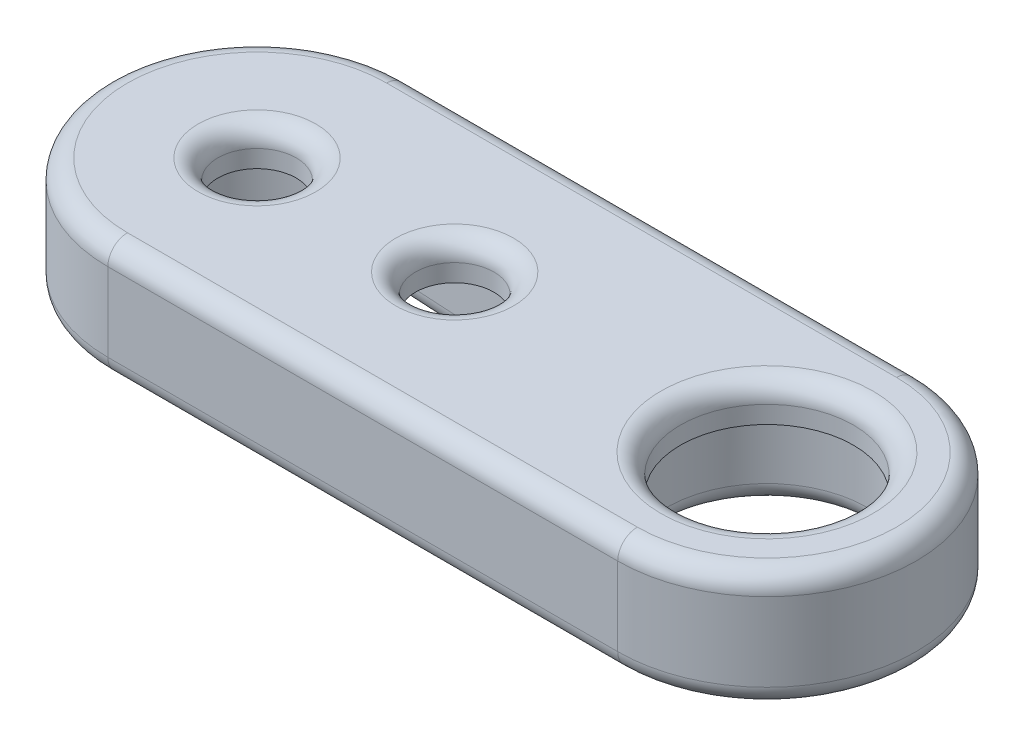
ISO-10303-21;
HEADER;
FILE_DESCRIPTION(('STEP AP214'),'2;1');
FILE_NAME('part.step','',(''),(''),'','','');
FILE_SCHEMA(('AUTOMOTIVE_DESIGN { 1 0 10303 214 1 1 1 1 }'));
ENDSEC;
DATA;
#1=APPLICATION_CONTEXT('core data for automotive mechanical design processes');
#2=APPLICATION_PROTOCOL_DEFINITION('international standard','automotive_design',2000,#1);
#3=PRODUCT_CONTEXT('',#1,'mechanical');
#4=PRODUCT('Part','Part','',(#3));
#5=PRODUCT_RELATED_PRODUCT_CATEGORY('part','',(#4));
#6=PRODUCT_DEFINITION_FORMATION('','',#4);
#7=PRODUCT_DEFINITION_CONTEXT('part definition',#1,'design');
#8=PRODUCT_DEFINITION('design','',#6,#7);
#9=PRODUCT_DEFINITION_SHAPE('','',#8);
#10=(LENGTH_UNIT() NAMED_UNIT(*) SI_UNIT(.MILLI.,.METRE.));
#11=(NAMED_UNIT(*) PLANE_ANGLE_UNIT() SI_UNIT($,.RADIAN.));
#12=(NAMED_UNIT(*) SI_UNIT($,.STERADIAN.) SOLID_ANGLE_UNIT());
#13=UNCERTAINTY_MEASURE_WITH_UNIT(LENGTH_MEASURE(1.E-05),#10,'distance_accuracy_value','');
#14=(GEOMETRIC_REPRESENTATION_CONTEXT(3) GLOBAL_UNCERTAINTY_ASSIGNED_CONTEXT((#13)) GLOBAL_UNIT_ASSIGNED_CONTEXT((#10,
#11,#12)) REPRESENTATION_CONTEXT('',''));
#15=CARTESIAN_POINT('',(0.,0.,0.));
#16=DIRECTION('',(0.,0.,1.));
#17=DIRECTION('',(1.,0.,0.));
#18=AXIS2_PLACEMENT_3D('',#15,#16,#17);
#19=CARTESIAN_POINT('',(0.,4.5,0.));
#20=DIRECTION('',(0.,-1.,0.));
#21=DIRECTION('',(0.,0.,-1.));
#22=AXIS2_PLACEMENT_3D('',#19,#20,#21);
#23=CYLINDRICAL_SURFACE('',#22,6.04);
#24=DIRECTION('',(0.,-1.,0.));
#25=VECTOR('',#24,1.);
#26=CARTESIAN_POINT('',(0.,4.5,6.04));
#27=LINE('',#26,#25);
#28=CARTESIAN_POINT('',(0.,5.20625,6.04));
#29=VERTEX_POINT('',#28);
#30=CARTESIAN_POINT('',(0.,2.03125,6.04));
#31=VERTEX_POINT('',#30);
#32=EDGE_CURVE('E218',#29,#31,#27,.T.);
#33=ORIENTED_EDGE('',*,*,#32,.F.);
#34=CARTESIAN_POINT('',(0.,5.20625,0.));
#35=DIRECTION('',(0.,-1.,0.));
#36=DIRECTION('',(0.,0.,-1.));
#37=AXIS2_PLACEMENT_3D('',#34,#35,#36);
#38=CIRCLE('',#37,6.04);
#39=CARTESIAN_POINT('',(0.,5.20625,-6.04));
#40=VERTEX_POINT('',#39);
#41=EDGE_CURVE('E61',#29,#40,#38,.T.);
#42=ORIENTED_EDGE('',*,*,#41,.T.);
#43=DIRECTION('',(0.,-1.,0.));
#44=VECTOR('',#43,1.);
#45=CARTESIAN_POINT('',(0.,4.5,-6.04));
#46=LINE('',#45,#44);
#47=CARTESIAN_POINT('',(0.,2.03125,-6.04));
#48=VERTEX_POINT('',#47);
#49=EDGE_CURVE('E201',#40,#48,#46,.T.);
#50=ORIENTED_EDGE('',*,*,#49,.T.);
#51=CARTESIAN_POINT('',(0.,2.03125,0.));
#52=DIRECTION('',(0.,-1.,0.));
#53=DIRECTION('',(0.,0.,-1.));
#54=AXIS2_PLACEMENT_3D('',#51,#52,#53);
#55=CIRCLE('',#54,6.04);
#56=EDGE_CURVE('E255',#48,#31,#55,.F.);
#57=ORIENTED_EDGE('',*,*,#56,.T.);
#58=EDGE_LOOP('',(#33,#42,#50,#57));
#59=FACE_BOUND('',#58,.T.);
#60=ADVANCED_FACE('F40',(#59),#23,.T.);
#61=CARTESIAN_POINT('',(0.,4.5,6.04));
#62=DIRECTION('',(0.,0.,-1.));
#63=DIRECTION('',(-1.,0.,0.));
#64=AXIS2_PLACEMENT_3D('',#61,#62,#63);
#65=PLANE('',#64);
#66=DIRECTION('',(0.,-1.,0.));
#67=VECTOR('',#66,1.);
#68=CARTESIAN_POINT('',(20.6375,4.5,6.04));
#69=LINE('',#68,#67);
#70=CARTESIAN_POINT('',(20.6375,5.20625,6.04));
#71=VERTEX_POINT('',#70);
#72=CARTESIAN_POINT('',(20.6375,2.03125,6.04));
#73=VERTEX_POINT('',#72);
#74=EDGE_CURVE('E215',#71,#73,#69,.T.);
#75=ORIENTED_EDGE('',*,*,#74,.F.);
#76=DIRECTION('',(-1.,0.,0.));
#77=VECTOR('',#76,1.);
#78=CARTESIAN_POINT('',(0.,5.20625,6.04));
#79=LINE('',#78,#77);
#80=EDGE_CURVE('E72',#71,#29,#79,.T.);
#81=ORIENTED_EDGE('',*,*,#80,.T.);
#82=ORIENTED_EDGE('',*,*,#32,.T.);
#83=DIRECTION('',(1.,0.,0.));
#84=VECTOR('',#83,1.);
#85=CARTESIAN_POINT('',(20.6375,2.03125,6.04));
#86=LINE('',#85,#84);
#87=EDGE_CURVE('E259',#31,#73,#86,.T.);
#88=ORIENTED_EDGE('',*,*,#87,.T.);
#89=EDGE_LOOP('',(#75,#81,#82,#88));
#90=FACE_BOUND('',#89,.T.);
#91=ADVANCED_FACE('F380',(#90),#65,.F.);
#92=CARTESIAN_POINT('',(20.6375,4.5,0.));
#93=DIRECTION('',(0.,-1.,0.));
#94=DIRECTION('',(0.,0.,-1.));
#95=AXIS2_PLACEMENT_3D('',#92,#93,#94);
#96=CYLINDRICAL_SURFACE('',#95,6.04);
#97=DIRECTION('',(0.,-1.,0.));
#98=VECTOR('',#97,1.);
#99=CARTESIAN_POINT('',(20.6375,4.5,-6.04));
#100=LINE('',#99,#98);
#101=CARTESIAN_POINT('',(20.6375,5.20625,-6.04));
#102=VERTEX_POINT('',#101);
#103=CARTESIAN_POINT('',(20.6375,2.03125,-6.04));
#104=VERTEX_POINT('',#103);
#105=EDGE_CURVE('E207',#102,#104,#100,.T.);
#106=ORIENTED_EDGE('',*,*,#105,.F.);
#107=CARTESIAN_POINT('',(20.6375,5.20625,0.));
#108=DIRECTION('',(0.,-1.,0.));
#109=DIRECTION('',(0.,0.,-1.));
#110=AXIS2_PLACEMENT_3D('',#107,#108,#109);
#111=CIRCLE('',#110,6.04);
#112=EDGE_CURVE('E282',#102,#71,#111,.T.);
#113=ORIENTED_EDGE('',*,*,#112,.T.);
#114=ORIENTED_EDGE('',*,*,#74,.T.);
#115=CARTESIAN_POINT('',(20.6375,2.03125,0.));
#116=DIRECTION('',(0.,-1.,0.));
#117=DIRECTION('',(0.,0.,-1.));
#118=AXIS2_PLACEMENT_3D('',#115,#116,#117);
#119=CIRCLE('',#118,6.04);
#120=EDGE_CURVE('E263',#73,#104,#119,.F.);
#121=ORIENTED_EDGE('',*,*,#120,.T.);
#122=EDGE_LOOP('',(#106,#113,#114,#121));
#123=FACE_BOUND('',#122,.T.);
#124=ADVANCED_FACE('F385',(#123),#96,.T.);
#125=CARTESIAN_POINT('',(0.,4.5,-6.04));
#126=DIRECTION('',(0.,0.,1.));
#127=DIRECTION('',(1.,0.,0.));
#128=AXIS2_PLACEMENT_3D('',#125,#126,#127);
#129=PLANE('',#128);
#130=ORIENTED_EDGE('',*,*,#49,.F.);
#131=DIRECTION('',(1.,0.,0.));
#132=VECTOR('',#131,1.);
#133=CARTESIAN_POINT('',(0.,5.20625,-6.04));
#134=LINE('',#133,#132);
#135=EDGE_CURVE('E431',#40,#102,#134,.T.);
#136=ORIENTED_EDGE('',*,*,#135,.T.);
#137=ORIENTED_EDGE('',*,*,#105,.T.);
#138=DIRECTION('',(-1.,0.,0.));
#139=VECTOR('',#138,1.);
#140=CARTESIAN_POINT('',(0.,2.03125,-6.04));
#141=LINE('',#140,#139);
#142=EDGE_CURVE('E221',#104,#48,#141,.T.);
#143=ORIENTED_EDGE('',*,*,#142,.T.);
#144=EDGE_LOOP('',(#130,#136,#137,#143));
#145=FACE_BOUND('',#144,.T.);
#146=ADVANCED_FACE('F428',(#145),#129,.F.);
#147=CARTESIAN_POINT('',(0.,4.5,0.));
#148=DIRECTION('',(0.,-1.,0.));
#149=DIRECTION('',(0.,0.,-1.));
#150=AXIS2_PLACEMENT_3D('',#147,#148,#149);
#151=CYLINDRICAL_SURFACE('',#150,3.5);
#152=DIRECTION('',(0.,-1.,0.));
#153=VECTOR('',#152,1.);
#154=CARTESIAN_POINT('',(2.28637267303474,4.5,2.65));
#155=LINE('',#154,#153);
#156=CARTESIAN_POINT('',(2.28637267303474,4.5,2.65));
#157=VERTEX_POINT('',#156);
#158=CARTESIAN_POINT('',(2.28637267303474,2.03125,2.65));
#159=VERTEX_POINT('',#158);
#160=EDGE_CURVE('E190',#157,#159,#155,.T.);
#161=ORIENTED_EDGE('',*,*,#160,.T.);
#162=CARTESIAN_POINT('',(0.,2.03125,0.));
#163=DIRECTION('',(0.,-1.,0.));
#164=DIRECTION('',(0.,0.,-1.));
#165=AXIS2_PLACEMENT_3D('',#162,#163,#164);
#166=CIRCLE('',#165,3.5);
#167=CARTESIAN_POINT('',(2.28637267303474,2.03125,-2.65));
#168=VERTEX_POINT('',#167);
#169=EDGE_CURVE('E271',#159,#168,#166,.T.);
#170=ORIENTED_EDGE('',*,*,#169,.T.);
#171=DIRECTION('',(0.,-1.,0.));
#172=VECTOR('',#171,1.);
#173=CARTESIAN_POINT('',(2.28637267303474,4.5,-2.65));
#174=LINE('',#173,#172);
#175=CARTESIAN_POINT('',(2.28637267303474,4.5,-2.65));
#176=VERTEX_POINT('',#175);
#177=EDGE_CURVE('E193',#176,#168,#174,.T.);
#178=ORIENTED_EDGE('',*,*,#177,.F.);
#179=CARTESIAN_POINT('',(0.,4.5,0.));
#180=DIRECTION('',(0.,1.,0.));
#181=DIRECTION('',(0.,0.,1.));
#182=AXIS2_PLACEMENT_3D('',#179,#180,#181);
#183=CIRCLE('',#182,3.5);
#184=EDGE_CURVE('E175',#176,#157,#183,.T.);
#185=ORIENTED_EDGE('',*,*,#184,.T.);
#186=EDGE_LOOP('',(#161,#170,#178,#185));
#187=FACE_BOUND('',#186,.T.);
#188=ADVANCED_FACE('F188',(#187),#151,.F.);
#189=CARTESIAN_POINT('',(2.28637267303474,4.5,2.65));
#190=DIRECTION('',(-0.0551466582265049,0.,-0.998478265204831));
#191=DIRECTION('',(-0.998478265204831,0.,0.0551466582265049));
#192=AXIS2_PLACEMENT_3D('',#189,#190,#191);
#193=PLANE('',#192);
#194=DIRECTION('',(0.,-1.,0.));
#195=VECTOR('',#194,1.);
#196=CARTESIAN_POINT('',(14.110293316453,4.5,1.99695653040966));
#197=LINE('',#196,#195);
#198=CARTESIAN_POINT('',(14.110293316453,4.5,1.99695653040966));
#199=VERTEX_POINT('',#198);
#200=CARTESIAN_POINT('',(14.110293316453,2.03125,1.99695653040966));
#201=VERTEX_POINT('',#200);
#202=EDGE_CURVE('E202',#199,#201,#197,.T.);
#203=ORIENTED_EDGE('',*,*,#202,.T.);
#204=DIRECTION('',(-0.998478265204831,0.,0.0551466582265049));
#205=VECTOR('',#204,1.);
#206=CARTESIAN_POINT('',(2.28637267303474,2.03125,2.65));
#207=LINE('',#206,#205);
#208=EDGE_CURVE('E199',#201,#159,#207,.T.);
#209=ORIENTED_EDGE('',*,*,#208,.T.);
#210=ORIENTED_EDGE('',*,*,#160,.F.);
#211=DIRECTION('',(0.998478265204831,0.,-0.0551466582265049));
#212=VECTOR('',#211,1.);
#213=CARTESIAN_POINT('',(2.28637267303474,4.5,2.65));
#214=LINE('',#213,#212);
#215=EDGE_CURVE('E172',#157,#199,#214,.T.);
#216=ORIENTED_EDGE('',*,*,#215,.T.);
#217=EDGE_LOOP('',(#203,#209,#210,#216));
#218=FACE_BOUND('',#217,.T.);
#219=ADVANCED_FACE('F197',(#218),#193,.T.);
#220=CARTESIAN_POINT('',(14.,4.5,0.));
#221=DIRECTION('',(0.,-1.,0.));
#222=DIRECTION('',(0.,0.,-1.));
#223=AXIS2_PLACEMENT_3D('',#220,#221,#222);
#224=CYLINDRICAL_SURFACE('',#223,2.);
#225=DIRECTION('',(0.,-1.,0.));
#226=VECTOR('',#225,1.);
#227=CARTESIAN_POINT('',(14.110293316453,4.5,-1.99695653040966));
#228=LINE('',#227,#226);
#229=CARTESIAN_POINT('',(14.110293316453,4.5,-1.99695653040966));
#230=VERTEX_POINT('',#229);
#231=CARTESIAN_POINT('',(14.110293316453,2.03125,-1.99695653040966));
#232=VERTEX_POINT('',#231);
#233=EDGE_CURVE('E210',#230,#232,#228,.T.);
#234=ORIENTED_EDGE('',*,*,#233,.T.);
#235=CARTESIAN_POINT('',(14.,2.03125,0.));
#236=DIRECTION('',(0.,-1.,0.));
#237=DIRECTION('',(0.,0.,-1.));
#238=AXIS2_PLACEMENT_3D('',#235,#236,#237);
#239=CIRCLE('',#238,2.);
#240=EDGE_CURVE('E277',#232,#201,#239,.T.);
#241=ORIENTED_EDGE('',*,*,#240,.T.);
#242=ORIENTED_EDGE('',*,*,#202,.F.);
#243=CARTESIAN_POINT('',(14.,4.5,0.));
#244=DIRECTION('',(0.,1.,0.));
#245=DIRECTION('',(0.,0.,-1.));
#246=AXIS2_PLACEMENT_3D('',#243,#244,#245);
#247=CIRCLE('',#246,2.);
#248=EDGE_CURVE('E178',#199,#230,#247,.T.);
#249=ORIENTED_EDGE('',*,*,#248,.T.);
#250=EDGE_LOOP('',(#234,#241,#242,#249));
#251=FACE_BOUND('',#250,.T.);
#252=ADVANCED_FACE('F514',(#251),#224,.F.);
#253=CARTESIAN_POINT('',(2.28637267303474,4.5,-2.65));
#254=DIRECTION('',(-0.0551466582265049,0.,0.998478265204831));
#255=DIRECTION('',(0.998478265204831,0.,0.0551466582265049));
#256=AXIS2_PLACEMENT_3D('',#253,#254,#255);
#257=PLANE('',#256);
#258=ORIENTED_EDGE('',*,*,#177,.T.);
#259=DIRECTION('',(0.998478265204831,0.,0.0551466582265049));
#260=VECTOR('',#259,1.);
#261=CARTESIAN_POINT('',(2.28637267303474,2.03125,-2.65));
#262=LINE('',#261,#260);
#263=EDGE_CURVE('E274',#168,#232,#262,.T.);
#264=ORIENTED_EDGE('',*,*,#263,.T.);
#265=ORIENTED_EDGE('',*,*,#233,.F.);
#266=DIRECTION('',(-0.998478265204831,0.,-0.0551466582265049));
#267=VECTOR('',#266,1.);
#268=CARTESIAN_POINT('',(2.28637267303474,4.5,-2.65));
#269=LINE('',#268,#267);
#270=EDGE_CURVE('E488',#230,#176,#269,.T.);
#271=ORIENTED_EDGE('',*,*,#270,.T.);
#272=EDGE_LOOP('',(#258,#264,#265,#271));
#273=FACE_BOUND('',#272,.T.);
#274=ADVANCED_FACE('F528',(#273),#257,.T.);
#275=CARTESIAN_POINT('',(20.6375,4.5,0.));
#276=DIRECTION('',(0.,-1.,0.));
#277=DIRECTION('',(0.,0.,-1.));
#278=AXIS2_PLACEMENT_3D('',#275,#276,#277);
#279=CYLINDRICAL_SURFACE('',#278,4.064);
#280=CARTESIAN_POINT('',(20.6375,2.03125,0.));
#281=DIRECTION('',(0.,-1.,0.));
#282=DIRECTION('',(0.,0.,-1.));
#283=AXIS2_PLACEMENT_3D('',#280,#281,#282);
#284=CIRCLE('',#283,4.064);
#285=CARTESIAN_POINT('',(20.6375,2.03125,-4.064));
#286=VERTEX_POINT('',#285);
#287=EDGE_CURVE('E267',#286,#286,#284,.T.);
#288=ORIENTED_EDGE('',*,*,#287,.T.);
#289=EDGE_LOOP('',(#288));
#290=FACE_BOUND('',#289,.T.);
#291=CARTESIAN_POINT('',(20.6375,4.5,0.));
#292=DIRECTION('',(0.,1.,0.));
#293=DIRECTION('',(0.,0.,1.));
#294=AXIS2_PLACEMENT_3D('',#291,#292,#293);
#295=CIRCLE('',#294,4.064);
#296=CARTESIAN_POINT('',(20.6375,4.5,4.064));
#297=VERTEX_POINT('',#296);
#298=EDGE_CURVE('E195',#297,#297,#295,.T.);
#299=ORIENTED_EDGE('',*,*,#298,.T.);
#300=EDGE_LOOP('',(#299));
#301=FACE_BOUND('',#300,.T.);
#302=ADVANCED_FACE('F530',(#290,#301),#279,.F.);
#303=CARTESIAN_POINT('',(20.6375,4.5,0.));
#304=DIRECTION('',(0.,1.,0.));
#305=DIRECTION('',(0.,0.,1.));
#306=AXIS2_PLACEMENT_3D('',#303,#304,#305);
#307=PLANE('',#306);
#308=CARTESIAN_POINT('',(8.,4.5,0.));
#309=DIRECTION('',(0.,1.,0.));
#310=DIRECTION('',(0.,0.,1.));
#311=AXIS2_PLACEMENT_3D('',#308,#309,#310);
#312=CIRCLE('',#311,1.5875);
#313=CARTESIAN_POINT('',(8.,4.5,1.5875));
#314=VERTEX_POINT('',#313);
#315=EDGE_CURVE('E483',#314,#314,#312,.T.);
#316=ORIENTED_EDGE('',*,*,#315,.T.);
#317=EDGE_LOOP('',(#316));
#318=FACE_BOUND('',#317,.T.);
#319=CARTESIAN_POINT('',(0.,4.5,0.));
#320=DIRECTION('',(0.,1.,0.));
#321=DIRECTION('',(0.,0.,1.));
#322=AXIS2_PLACEMENT_3D('',#319,#320,#321);
#323=CIRCLE('',#322,1.5875);
#324=CARTESIAN_POINT('',(0.,4.5,1.5875));
#325=VERTEX_POINT('',#324);
#326=EDGE_CURVE('E298',#325,#325,#323,.T.);
#327=ORIENTED_EDGE('',*,*,#326,.T.);
#328=EDGE_LOOP('',(#327));
#329=FACE_BOUND('',#328,.T.);
#330=ORIENTED_EDGE('',*,*,#184,.F.);
#331=ORIENTED_EDGE('',*,*,#270,.F.);
#332=ORIENTED_EDGE('',*,*,#248,.F.);
#333=ORIENTED_EDGE('',*,*,#215,.F.);
#334=EDGE_LOOP('',(#330,#331,#332,#333));
#335=FACE_BOUND('',#334,.T.);
#336=ADVANCED_FACE('F174',(#318,#329,#335),#307,.F.);
#337=CARTESIAN_POINT('',(20.6375,4.5,0.));
#338=DIRECTION('',(0.,1.,0.));
#339=DIRECTION('',(0.,0.,1.));
#340=AXIS2_PLACEMENT_3D('',#337,#338,#339);
#341=CIRCLE('',#340,3.5);
#342=CARTESIAN_POINT('',(20.6375,4.5,3.5));
#343=VERTEX_POINT('',#342);
#344=EDGE_CURVE('E485',#343,#343,#341,.T.);
#345=ORIENTED_EDGE('',*,*,#344,.T.);
#346=EDGE_LOOP('',(#345));
#347=FACE_BOUND('',#346,.T.);
#348=ORIENTED_EDGE('',*,*,#298,.F.);
#349=EDGE_LOOP('',(#348));
#350=FACE_BOUND('',#349,.T.);
#351=ADVANCED_FACE('F681',(#347,#350),#307,.F.);
#352=CARTESIAN_POINT('',(0.,46.8763703135805,0.));
#353=DIRECTION('',(0.,-1.,0.));
#354=DIRECTION('',(0.,0.,-1.));
#355=AXIS2_PLACEMENT_3D('',#352,#353,#354);
#356=CYLINDRICAL_SURFACE('',#355,1.5875);
#357=CARTESIAN_POINT('',(0.,5.20625,0.));
#358=DIRECTION('',(0.,-1.,0.));
#359=DIRECTION('',(0.,0.,-1.));
#360=AXIS2_PLACEMENT_3D('',#357,#358,#359);
#361=CIRCLE('',#360,1.5875);
#362=CARTESIAN_POINT('',(0.,5.20625,-1.5875));
#363=VERTEX_POINT('',#362);
#364=EDGE_CURVE('E434',#363,#363,#361,.F.);
#365=ORIENTED_EDGE('',*,*,#364,.T.);
#366=EDGE_LOOP('',(#365));
#367=FACE_BOUND('',#366,.T.);
#368=ORIENTED_EDGE('',*,*,#326,.F.);
#369=EDGE_LOOP('',(#368));
#370=FACE_BOUND('',#369,.T.);
#371=ADVANCED_FACE('F675',(#367,#370),#356,.F.);
#372=CARTESIAN_POINT('',(20.6375,46.8763703135805,0.));
#373=DIRECTION('',(0.,-1.,0.));
#374=DIRECTION('',(0.,0.,-1.));
#375=AXIS2_PLACEMENT_3D('',#372,#373,#374);
#376=CYLINDRICAL_SURFACE('',#375,3.5);
#377=CARTESIAN_POINT('',(20.6375,5.20625,0.));
#378=DIRECTION('',(0.,-1.,0.));
#379=DIRECTION('',(0.,0.,-1.));
#380=AXIS2_PLACEMENT_3D('',#377,#378,#379);
#381=CIRCLE('',#380,3.5);
#382=CARTESIAN_POINT('',(20.6375,5.20625,-3.5));
#383=VERTEX_POINT('',#382);
#384=EDGE_CURVE('E50',#383,#383,#381,.F.);
#385=ORIENTED_EDGE('',*,*,#384,.T.);
#386=EDGE_LOOP('',(#385));
#387=FACE_BOUND('',#386,.T.);
#388=ORIENTED_EDGE('',*,*,#344,.F.);
#389=EDGE_LOOP('',(#388));
#390=FACE_BOUND('',#389,.T.);
#391=ADVANCED_FACE('F680',(#387,#390),#376,.F.);
#392=CARTESIAN_POINT('',(8.,46.8763703135805,0.));
#393=DIRECTION('',(0.,-1.,0.));
#394=DIRECTION('',(0.,0.,-1.));
#395=AXIS2_PLACEMENT_3D('',#392,#393,#394);
#396=CYLINDRICAL_SURFACE('',#395,1.5875);
#397=CARTESIAN_POINT('',(8.,5.20625,0.));
#398=DIRECTION('',(0.,-1.,0.));
#399=DIRECTION('',(0.,0.,-1.));
#400=AXIS2_PLACEMENT_3D('',#397,#398,#399);
#401=CIRCLE('',#400,1.5875);
#402=CARTESIAN_POINT('',(8.,5.20625,-1.5875));
#403=VERTEX_POINT('',#402);
#404=EDGE_CURVE('E12',#403,#403,#401,.F.);
#405=ORIENTED_EDGE('',*,*,#404,.T.);
#406=EDGE_LOOP('',(#405));
#407=FACE_BOUND('',#406,.T.);
#408=ORIENTED_EDGE('',*,*,#315,.F.);
#409=EDGE_LOOP('',(#408));
#410=FACE_BOUND('',#409,.T.);
#411=ADVANCED_FACE('F693',(#407,#410),#396,.F.);
#412=CARTESIAN_POINT('',(0.,6.,0.));
#413=DIRECTION('',(0.,-1.,0.));
#414=DIRECTION('',(0.,0.,-1.));
#415=AXIS2_PLACEMENT_3D('',#412,#413,#414);
#416=PLANE('',#415);
#417=DIRECTION('',(-1.,0.,0.));
#418=VECTOR('',#417,1.);
#419=CARTESIAN_POINT('',(0.,6.,5.24625));
#420=LINE('',#419,#418);
#421=CARTESIAN_POINT('',(0.,6.,5.24625));
#422=VERTEX_POINT('',#421);
#423=CARTESIAN_POINT('',(20.6375,6.,5.24625));
#424=VERTEX_POINT('',#423);
#425=EDGE_CURVE('E465',#422,#424,#420,.F.);
#426=ORIENTED_EDGE('',*,*,#425,.T.);
#427=CARTESIAN_POINT('',(20.6375,6.,0.));
#428=DIRECTION('',(0.,-1.,0.));
#429=DIRECTION('',(0.,0.,-1.));
#430=AXIS2_PLACEMENT_3D('',#427,#428,#429);
#431=CIRCLE('',#430,5.24625);
#432=CARTESIAN_POINT('',(20.6375,6.,-5.24625));
#433=VERTEX_POINT('',#432);
#434=EDGE_CURVE('E468',#424,#433,#431,.F.);
#435=ORIENTED_EDGE('',*,*,#434,.T.);
#436=DIRECTION('',(1.,0.,0.));
#437=VECTOR('',#436,1.);
#438=CARTESIAN_POINT('',(0.,6.,-5.24625));
#439=LINE('',#438,#437);
#440=CARTESIAN_POINT('',(0.,6.,-5.24625));
#441=VERTEX_POINT('',#440);
#442=EDGE_CURVE('E460',#433,#441,#439,.F.);
#443=ORIENTED_EDGE('',*,*,#442,.T.);
#444=CARTESIAN_POINT('',(0.,6.,0.));
#445=DIRECTION('',(0.,-1.,0.));
#446=DIRECTION('',(0.,0.,-1.));
#447=AXIS2_PLACEMENT_3D('',#444,#445,#446);
#448=CIRCLE('',#447,5.24625);
#449=EDGE_CURVE('E463',#441,#422,#448,.F.);
#450=ORIENTED_EDGE('',*,*,#449,.T.);
#451=EDGE_LOOP('',(#426,#435,#443,#450));
#452=FACE_BOUND('',#451,.T.);
#453=CARTESIAN_POINT('',(0.,6.,0.));
#454=DIRECTION('',(0.,-1.,0.));
#455=DIRECTION('',(0.,0.,-1.));
#456=AXIS2_PLACEMENT_3D('',#453,#454,#455);
#457=CIRCLE('',#456,2.38125);
#458=CARTESIAN_POINT('',(0.,6.,-2.38125));
#459=VERTEX_POINT('',#458);
#460=EDGE_CURVE('E470',#459,#459,#457,.T.);
#461=ORIENTED_EDGE('',*,*,#460,.T.);
#462=EDGE_LOOP('',(#461));
#463=FACE_BOUND('',#462,.T.);
#464=CARTESIAN_POINT('',(20.6375,6.,0.));
#465=DIRECTION('',(0.,-1.,0.));
#466=DIRECTION('',(0.,0.,-1.));
#467=AXIS2_PLACEMENT_3D('',#464,#465,#466);
#468=CIRCLE('',#467,4.29375);
#469=CARTESIAN_POINT('',(20.6375,6.,-4.29375));
#470=VERTEX_POINT('',#469);
#471=EDGE_CURVE('E481',#470,#470,#468,.T.);
#472=ORIENTED_EDGE('',*,*,#471,.T.);
#473=EDGE_LOOP('',(#472));
#474=FACE_BOUND('',#473,.T.);
#475=CARTESIAN_POINT('',(8.,6.,0.));
#476=DIRECTION('',(0.,-1.,0.));
#477=DIRECTION('',(0.,0.,-1.));
#478=AXIS2_PLACEMENT_3D('',#475,#476,#477);
#479=CIRCLE('',#478,2.38125);
#480=CARTESIAN_POINT('',(8.,6.,-2.38125));
#481=VERTEX_POINT('',#480);
#482=EDGE_CURVE('E479',#481,#481,#479,.T.);
#483=ORIENTED_EDGE('',*,*,#482,.T.);
#484=EDGE_LOOP('',(#483));
#485=FACE_BOUND('',#484,.T.);
#486=ADVANCED_FACE('F406',(#452,#463,#474,#485),#416,.F.);
#487=CARTESIAN_POINT('',(0.,1.2375,0.));
#488=DIRECTION('',(0.,-1.,0.));
#489=DIRECTION('',(0.,0.,-1.));
#490=AXIS2_PLACEMENT_3D('',#487,#488,#489);
#491=PLANE('',#490);
#492=CARTESIAN_POINT('',(0.,1.2375,0.));
#493=DIRECTION('',(0.,-1.,0.));
#494=DIRECTION('',(0.,0.,-1.));
#495=AXIS2_PLACEMENT_3D('',#492,#493,#494);
#496=CIRCLE('',#495,5.24625);
#497=CARTESIAN_POINT('',(0.,1.2375,5.24625));
#498=VERTEX_POINT('',#497);
#499=CARTESIAN_POINT('',(0.,1.2375,-5.24625));
#500=VERTEX_POINT('',#499);
#501=EDGE_CURVE('E248',#498,#500,#496,.T.);
#502=ORIENTED_EDGE('',*,*,#501,.T.);
#503=DIRECTION('',(-1.,0.,0.));
#504=VECTOR('',#503,1.);
#505=CARTESIAN_POINT('',(20.6375,1.2375,-5.24625));
#506=LINE('',#505,#504);
#507=CARTESIAN_POINT('',(20.6375,1.2375,-5.24625));
#508=VERTEX_POINT('',#507);
#509=EDGE_CURVE('E251',#500,#508,#506,.F.);
#510=ORIENTED_EDGE('',*,*,#509,.T.);
#511=CARTESIAN_POINT('',(20.6375,1.2375,0.));
#512=DIRECTION('',(0.,-1.,0.));
#513=DIRECTION('',(0.,0.,-1.));
#514=AXIS2_PLACEMENT_3D('',#511,#512,#513);
#515=CIRCLE('',#514,5.24625);
#516=CARTESIAN_POINT('',(20.6375,1.2375,5.24625));
#517=VERTEX_POINT('',#516);
#518=EDGE_CURVE('E242',#508,#517,#515,.T.);
#519=ORIENTED_EDGE('',*,*,#518,.T.);
#520=DIRECTION('',(1.,0.,0.));
#521=VECTOR('',#520,1.);
#522=CARTESIAN_POINT('',(0.,1.2375,5.24625));
#523=LINE('',#522,#521);
#524=EDGE_CURVE('E245',#517,#498,#523,.F.);
#525=ORIENTED_EDGE('',*,*,#524,.T.);
#526=EDGE_LOOP('',(#502,#510,#519,#525));
#527=FACE_BOUND('',#526,.T.);
#528=CARTESIAN_POINT('',(14.,1.2375,0.));
#529=DIRECTION('',(0.,-1.,0.));
#530=DIRECTION('',(0.,0.,-1.));
#531=AXIS2_PLACEMENT_3D('',#528,#529,#530);
#532=CIRCLE('',#531,2.79375);
#533=CARTESIAN_POINT('',(16.1290930508475,1.2375,-1.80886755826209));
#534=VERTEX_POINT('',#533);
#535=CARTESIAN_POINT('',(14.1540659764203,1.2375,-2.789498653416));
#536=VERTEX_POINT('',#535);
#537=EDGE_CURVE('E237',#534,#536,#532,.F.);
#538=ORIENTED_EDGE('',*,*,#537,.T.);
#539=DIRECTION('',(0.998478265204831,0.,0.0551466582265049));
#540=VECTOR('',#539,1.);
#541=CARTESIAN_POINT('',(0.196642131210011,1.2375,-3.56037700834582));
#542=LINE('',#541,#540);
#543=CARTESIAN_POINT('',(2.58493378599355,1.2375,-3.42846997719523));
#544=VERTEX_POINT('',#543);
#545=EDGE_CURVE('E239',#536,#544,#542,.F.);
#546=ORIENTED_EDGE('',*,*,#545,.T.);
#547=CARTESIAN_POINT('',(0.,1.2375,0.));
#548=DIRECTION('',(0.,-1.,0.));
#549=DIRECTION('',(0.,0.,-1.));
#550=AXIS2_PLACEMENT_3D('',#547,#548,#549);
#551=CIRCLE('',#550,4.29375);
#552=CARTESIAN_POINT('',(2.58493378599355,1.2375,3.42846997719523));
#553=VERTEX_POINT('',#552);
#554=EDGE_CURVE('E231',#544,#553,#551,.F.);
#555=ORIENTED_EDGE('',*,*,#554,.T.);
#556=DIRECTION('',(-0.998478265204831,0.,0.0551466582265049));
#557=VECTOR('',#556,1.);
#558=CARTESIAN_POINT('',(0.196642131210011,1.2375,3.56037700834582));
#559=LINE('',#558,#557);
#560=CARTESIAN_POINT('',(14.1540659764203,1.2375,2.789498653416));
#561=VERTEX_POINT('',#560);
#562=EDGE_CURVE('E225',#553,#561,#559,.F.);
#563=ORIENTED_EDGE('',*,*,#562,.T.);
#564=CARTESIAN_POINT('',(14.,1.2375,0.));
#565=DIRECTION('',(0.,-1.,0.));
#566=DIRECTION('',(0.,0.,-1.));
#567=AXIS2_PLACEMENT_3D('',#564,#565,#566);
#568=CIRCLE('',#567,2.79375);
#569=CARTESIAN_POINT('',(16.1290930508475,1.2375,1.80886755826209));
#570=VERTEX_POINT('',#569);
#571=EDGE_CURVE('E228',#561,#570,#568,.F.);
#572=ORIENTED_EDGE('',*,*,#571,.T.);
#573=CARTESIAN_POINT('',(20.6375,1.2375,0.));
#574=DIRECTION('',(0.,-1.,0.));
#575=DIRECTION('',(0.,0.,-1.));
#576=AXIS2_PLACEMENT_3D('',#573,#574,#575);
#577=CIRCLE('',#576,4.85775);
#578=EDGE_CURVE('E233',#570,#534,#577,.F.);
#579=ORIENTED_EDGE('',*,*,#578,.T.);
#580=EDGE_LOOP('',(#538,#546,#555,#563,#572,#579));
#581=FACE_BOUND('',#580,.T.);
#582=ADVANCED_FACE('F401',(#527,#581),#491,.T.);
#583=CARTESIAN_POINT('',(0.,2.03125,5.24625));
#584=DIRECTION('',(-1.,0.,0.));
#585=DIRECTION('',(0.,0.,1.));
#586=AXIS2_PLACEMENT_3D('',#583,#584,#585);
#587=CYLINDRICAL_SURFACE('',#586,0.79375);
#588=CARTESIAN_POINT('',(0.,2.03125,5.24625));
#589=DIRECTION('',(-1.,0.,0.));
#590=DIRECTION('',(0.,0.,1.));
#591=AXIS2_PLACEMENT_3D('',#588,#589,#590);
#592=CIRCLE('',#591,0.79375);
#593=EDGE_CURVE('E290',#498,#31,#592,.T.);
#594=ORIENTED_EDGE('',*,*,#593,.F.);
#595=ORIENTED_EDGE('',*,*,#524,.F.);
#596=CARTESIAN_POINT('',(20.6375,2.03125,5.24625));
#597=DIRECTION('',(1.,0.,0.));
#598=DIRECTION('',(0.,0.,-1.));
#599=AXIS2_PLACEMENT_3D('',#596,#597,#598);
#600=CIRCLE('',#599,0.79375);
#601=EDGE_CURVE('E294',#73,#517,#600,.T.);
#602=ORIENTED_EDGE('',*,*,#601,.F.);
#603=ORIENTED_EDGE('',*,*,#87,.F.);
#604=EDGE_LOOP('',(#594,#595,#602,#603));
#605=FACE_BOUND('',#604,.T.);
#606=ADVANCED_FACE('F398',(#605),#587,.T.);
#607=CARTESIAN_POINT('',(20.6375,2.03125,0.));
#608=DIRECTION('',(0.,-1.,0.));
#609=DIRECTION('',(0.,0.,-1.));
#610=AXIS2_PLACEMENT_3D('',#607,#608,#609);
#611=TOROIDAL_SURFACE('',#610,5.24625,0.79375);
#612=ORIENTED_EDGE('',*,*,#601,.T.);
#613=ORIENTED_EDGE('',*,*,#518,.F.);
#614=CARTESIAN_POINT('',(20.6375,2.03125,-5.24625));
#615=DIRECTION('',(-1.,0.,0.));
#616=DIRECTION('',(0.,0.,1.));
#617=AXIS2_PLACEMENT_3D('',#614,#615,#616);
#618=CIRCLE('',#617,0.79375);
#619=EDGE_CURVE('E287',#104,#508,#618,.T.);
#620=ORIENTED_EDGE('',*,*,#619,.F.);
#621=ORIENTED_EDGE('',*,*,#120,.F.);
#622=EDGE_LOOP('',(#612,#613,#620,#621));
#623=FACE_BOUND('',#622,.T.);
#624=ADVANCED_FACE('F395',(#623),#611,.T.);
#625=CARTESIAN_POINT('',(0.,2.03125,0.));
#626=DIRECTION('',(0.,-1.,0.));
#627=DIRECTION('',(0.,0.,-1.));
#628=AXIS2_PLACEMENT_3D('',#625,#626,#627);
#629=TOROIDAL_SURFACE('',#628,5.24625,0.79375);
#630=ORIENTED_EDGE('',*,*,#593,.T.);
#631=ORIENTED_EDGE('',*,*,#56,.F.);
#632=CARTESIAN_POINT('',(0.,2.03125,-5.24625));
#633=DIRECTION('',(1.,0.,0.));
#634=DIRECTION('',(0.,0.,-1.));
#635=AXIS2_PLACEMENT_3D('',#632,#633,#634);
#636=CIRCLE('',#635,0.79375);
#637=EDGE_CURVE('E283',#500,#48,#636,.T.);
#638=ORIENTED_EDGE('',*,*,#637,.F.);
#639=ORIENTED_EDGE('',*,*,#501,.F.);
#640=EDGE_LOOP('',(#630,#631,#638,#639));
#641=FACE_BOUND('',#640,.T.);
#642=ADVANCED_FACE('F391',(#641),#629,.T.);
#643=CARTESIAN_POINT('',(0.,2.03125,-5.24625));
#644=DIRECTION('',(1.,0.,0.));
#645=DIRECTION('',(0.,0.,-1.));
#646=AXIS2_PLACEMENT_3D('',#643,#644,#645);
#647=CYLINDRICAL_SURFACE('',#646,0.79375);
#648=ORIENTED_EDGE('',*,*,#619,.T.);
#649=ORIENTED_EDGE('',*,*,#509,.F.);
#650=ORIENTED_EDGE('',*,*,#637,.T.);
#651=ORIENTED_EDGE('',*,*,#142,.F.);
#652=EDGE_LOOP('',(#648,#649,#650,#651));
#653=FACE_BOUND('',#652,.T.);
#654=ADVANCED_FACE('F328',(#653),#647,.T.);
#655=CARTESIAN_POINT('',(0.,2.03125,0.));
#656=DIRECTION('',(0.,-1.,0.));
#657=DIRECTION('',(0.,0.,-1.));
#658=AXIS2_PLACEMENT_3D('',#655,#656,#657);
#659=TOROIDAL_SURFACE('',#658,4.29375,0.79375);
#660=CARTESIAN_POINT('',(2.28637267303474,2.03125,2.65));
#661=CARTESIAN_POINT('',(2.28637228616272,2.00975184022616,2.64999955774489));
#662=CARTESIAN_POINT('',(2.28671818616901,1.98826433603973,2.65085623576046));
#663=CARTESIAN_POINT('',(2.28809520834278,1.94545050596914,2.65426995849144));
#664=CARTESIAN_POINT('',(2.28912621572453,1.92412415369017,2.6568267183681));
#665=CARTESIAN_POINT('',(2.29322747226394,1.86071835044313,2.66700546000881));
#666=CARTESIAN_POINT('',(2.29730605799144,1.81907585455148,2.67713610596712));
#667=CARTESIAN_POINT('',(2.30797120951821,1.73823723747756,2.70372033903129));
#668=CARTESIAN_POINT('',(2.31455751729719,1.69904086509564,2.72017327563637));
#669=CARTESIAN_POINT('',(2.32996425560527,1.62407230200507,2.75884079185468));
#670=CARTESIAN_POINT('',(2.33878522331564,1.58830093747386,2.78105675685088));
#671=CARTESIAN_POINT('',(2.35856162427975,1.52023667435874,2.83114467138439));
#672=CARTESIAN_POINT('',(2.36956321507609,1.48804789741669,2.85913959832291));
#673=CARTESIAN_POINT('',(2.39317163859549,1.42887784067157,2.91960487622751));
#674=CARTESIAN_POINT('',(2.40577903562126,1.40189839992798,2.95207680080542));
#675=CARTESIAN_POINT('',(2.43285818666446,1.35251016747311,3.02231013648477));
#676=CARTESIAN_POINT('',(2.44739144712914,1.33039505187079,3.06025419043166));
#677=CARTESIAN_POINT('',(2.47734122259482,1.29299217940967,3.13904616932642));
#678=CARTESIAN_POINT('',(2.49275765324018,1.27770377172328,3.17989381702816));
#679=CARTESIAN_POINT('',(2.52058582142758,1.25684836863874,3.25419268999926));
#680=CARTESIAN_POINT('',(2.53291215408255,1.24988239803546,3.28729331236429));
#681=CARTESIAN_POINT('',(2.55762830607208,1.24038507541783,3.35405452570699));
#682=CARTESIAN_POINT('',(2.57001795901331,1.23784527207508,3.38771392535937));
#683=CARTESIAN_POINT('',(2.58320488052407,1.23751092588607,3.42374340426857));
#684=CARTESIAN_POINT('',(2.58406951928752,1.23749997098474,3.42610672656928));
#685=CARTESIAN_POINT('',(2.58493378599355,1.2375,3.42846997719523));
#686=B_SPLINE_CURVE_WITH_KNOTS('',3,(#660,#661,#662,#663,#664,#665,#666,#667,#668,#669,#670,
#671,#672,#673,#674,#675,#676,#677,#678,#679,#680,#681,#682,#683,#684,#685),.UNSPECIFIED.,.F.,
.F.,(4,2,2,2,2,2,2,2,2,2,2,2,4),(0.,0.064453662966613,0.128896529819953,0.257378723950158,
0.385847702079268,0.514347591722212,0.64593232338725,0.777563424005052,0.915734288850371,
1.05389197829352,1.16164466357765,1.26919137942156,1.27674091065004),.UNSPECIFIED.);
#687=EDGE_CURVE('E334',#553,#159,#686,.F.);
#688=ORIENTED_EDGE('',*,*,#687,.F.);
#689=ORIENTED_EDGE('',*,*,#554,.F.);
#690=CARTESIAN_POINT('',(2.28637267303474,2.03125,-2.65));
#691=CARTESIAN_POINT('',(2.28637228616272,2.00975184022616,-2.64999955774489));
#692=CARTESIAN_POINT('',(2.28671818616901,1.98826433603973,-2.65085623576046));
#693=CARTESIAN_POINT('',(2.28809520834278,1.94545050596914,-2.65426995849144));
#694=CARTESIAN_POINT('',(2.28912621572453,1.92412415369017,-2.6568267183681));
#695=CARTESIAN_POINT('',(2.29322747226394,1.86071835044313,-2.66700546000881));
#696=CARTESIAN_POINT('',(2.29730605799144,1.81907585455148,-2.67713610596712));
#697=CARTESIAN_POINT('',(2.30797120951821,1.73823723747756,-2.70372033903129));
#698=CARTESIAN_POINT('',(2.31455751729719,1.69904086509564,-2.72017327563637));
#699=CARTESIAN_POINT('',(2.32996425560527,1.62407230200507,-2.75884079185468));
#700=CARTESIAN_POINT('',(2.33878522331564,1.58830093747386,-2.78105675685088));
#701=CARTESIAN_POINT('',(2.35856162427975,1.52023667435874,-2.83114467138439));
#702=CARTESIAN_POINT('',(2.36956321507609,1.48804789741669,-2.85913959832291));
#703=CARTESIAN_POINT('',(2.39317163859549,1.42887784067157,-2.91960487622751));
#704=CARTESIAN_POINT('',(2.40577903562126,1.40189839992798,-2.95207680080542));
#705=CARTESIAN_POINT('',(2.43285818666446,1.35251016747311,-3.02231013648477));
#706=CARTESIAN_POINT('',(2.44739144712914,1.33039505187079,-3.06025419043166));
#707=CARTESIAN_POINT('',(2.47734122259483,1.29299217940967,-3.13904616932642));
#708=CARTESIAN_POINT('',(2.49275765324019,1.27770377172328,-3.17989381702815));
#709=CARTESIAN_POINT('',(2.52058582142757,1.25684836863874,-3.25419268999926));
#710=CARTESIAN_POINT('',(2.53291215408252,1.24988239803546,-3.2872933123643));
#711=CARTESIAN_POINT('',(2.55762830607211,1.24038507541783,-3.35405452570698));
#712=CARTESIAN_POINT('',(2.57001795901341,1.23784527207508,-3.38771392535933));
#713=CARTESIAN_POINT('',(2.58320488052409,1.23751092588607,-3.42374340426856));
#714=CARTESIAN_POINT('',(2.58406951928753,1.23749997098474,-3.42610672656928));
#715=CARTESIAN_POINT('',(2.58493378599355,1.2375,-3.42846997719523));
#716=B_SPLINE_CURVE_WITH_KNOTS('',3,(#690,#691,#692,#693,#694,#695,#696,#697,#698,#699,#700,
#701,#702,#703,#704,#705,#706,#707,#708,#709,#710,#711,#712,#713,#714,#715),.UNSPECIFIED.,.F.,
.F.,(4,2,2,2,2,2,2,2,2,2,2,2,4),(0.,0.064453662966613,0.128896529819953,0.257378723950158,
0.385847702079268,0.514347591722212,0.64593232338725,0.777563424005052,0.915734288850371,
1.05389197829352,1.16164466357764,1.26919137942156,1.27674091065004),.UNSPECIFIED.);
#717=EDGE_CURVE('E288',#168,#544,#716,.T.);
#718=ORIENTED_EDGE('',*,*,#717,.F.);
#719=ORIENTED_EDGE('',*,*,#169,.F.);
#720=EDGE_LOOP('',(#688,#689,#718,#719));
#721=FACE_BOUND('',#720,.T.);
#722=ADVANCED_FACE('F323',(#721),#659,.T.);
#723=CARTESIAN_POINT('',(2.33014533300202,2.03125,-3.44254212300633));
#724=DIRECTION('',(0.998478265204831,0.,0.0551466582265049));
#725=DIRECTION('',(0.0551466582265049,0.,-0.998478265204831));
#726=AXIS2_PLACEMENT_3D('',#723,#724,#725);
#727=CYLINDRICAL_SURFACE('',#726,0.79375);
#728=ORIENTED_EDGE('',*,*,#717,.T.);
#729=ORIENTED_EDGE('',*,*,#545,.F.);
#730=CARTESIAN_POINT('',(14.1540659764203,2.03125,-2.789498653416));
#731=DIRECTION('',(0.998478265204831,0.,0.055146658226505));
#732=DIRECTION('',(0.055146658226505,0.,-0.998478265204831));
#733=AXIS2_PLACEMENT_3D('',#730,#731,#732);
#734=CIRCLE('',#733,0.79375);
#735=EDGE_CURVE('E477',#232,#536,#734,.T.);
#736=ORIENTED_EDGE('',*,*,#735,.F.);
#737=ORIENTED_EDGE('',*,*,#263,.F.);
#738=EDGE_LOOP('',(#728,#729,#736,#737));
#739=FACE_BOUND('',#738,.T.);
#740=ADVANCED_FACE('F327',(#739),#727,.T.);
#741=CARTESIAN_POINT('',(2.33014533300202,2.03125,3.44254212300633));
#742=DIRECTION('',(-0.998478265204831,0.,0.0551466582265049));
#743=DIRECTION('',(0.0551466582265049,0.,0.998478265204831));
#744=AXIS2_PLACEMENT_3D('',#741,#742,#743);
#745=CYLINDRICAL_SURFACE('',#744,0.79375);
#746=ORIENTED_EDGE('',*,*,#687,.T.);
#747=ORIENTED_EDGE('',*,*,#208,.F.);
#748=CARTESIAN_POINT('',(14.1540659764203,2.03125,2.789498653416));
#749=DIRECTION('',(0.998478265204831,0.,-0.055146658226505));
#750=DIRECTION('',(-0.055146658226505,0.,-0.998478265204831));
#751=AXIS2_PLACEMENT_3D('',#748,#749,#750);
#752=CIRCLE('',#751,0.79375);
#753=EDGE_CURVE('E308',#561,#201,#752,.T.);
#754=ORIENTED_EDGE('',*,*,#753,.F.);
#755=ORIENTED_EDGE('',*,*,#562,.F.);
#756=EDGE_LOOP('',(#746,#747,#754,#755));
#757=FACE_BOUND('',#756,.T.);
#758=ADVANCED_FACE('F317',(#757),#745,.T.);
#759=CARTESIAN_POINT('',(14.,2.03125,0.));
#760=DIRECTION('',(0.,-1.,0.));
#761=DIRECTION('',(0.,0.,-1.));
#762=AXIS2_PLACEMENT_3D('',#759,#760,#761);
#763=TOROIDAL_SURFACE('',#762,2.79375,0.79375);
#764=CARTESIAN_POINT('',(16.1290930508475,1.2375,1.80886755826209));
#765=CARTESIAN_POINT('',(16.1294138567725,1.23750001093407,1.80689659648063));
#766=CARTESIAN_POINT('',(16.1297342766544,1.23750202185787,1.80492557037847));
#767=CARTESIAN_POINT('',(16.1514486476533,1.23777326149227,1.67118624665585));
#768=CARTESIAN_POINT('',(16.1711121269467,1.24691896962853,1.5391404893529));
#769=CARTESIAN_POINT('',(16.2062800702473,1.27506148867999,1.27539945989748));
#770=CARTESIAN_POINT('',(16.2217710118942,1.29408975725573,1.14370666483924));
#771=CARTESIAN_POINT('',(16.241509153558,1.32421608826679,0.946217414401987));
#772=CARTESIAN_POINT('',(16.2475009927612,1.33451046173237,0.880465521674163));
#773=CARTESIAN_POINT('',(16.2582752797535,1.35459807992116,0.748776413941018));
#774=CARTESIAN_POINT('',(16.2630576154125,1.36439127811452,0.682839182325907));
#775=CARTESIAN_POINT('',(16.2713387590195,1.38236932007999,0.550939855596724));
#776=CARTESIAN_POINT('',(16.274842881709,1.39056075635804,0.484979031901723));
#777=CARTESIAN_POINT('',(16.280538269022,1.40437015058087,0.352739061158556));
#778=CARTESIAN_POINT('',(16.2827298761463,1.40998877980941,0.286460001708611));
#779=CARTESIAN_POINT('',(16.2861049178032,1.41875067831216,0.138202763736074));
#780=CARTESIAN_POINT('',(16.2869351939109,1.42101398095945,0.0561594882804308));
#781=CARTESIAN_POINT('',(16.2864954408313,1.41984262524909,-0.107879214934439));
#782=CARTESIAN_POINT('',(16.285225329415,1.41640774381096,-0.189874640694661));
#783=CARTESIAN_POINT('',(16.2806230753273,1.40461878649163,-0.353825979762658));
#784=CARTESIAN_POINT('',(16.2772809633924,1.3962409373952,-0.435779773394883));
#785=CARTESIAN_POINT('',(16.2686256397341,1.37628121507454,-0.599197526994176));
#786=CARTESIAN_POINT('',(16.2633115903278,1.364697980729,-0.68066126381726));
#787=CARTESIAN_POINT('',(16.250800647676,1.34030536944854,-0.843503023436689));
#788=CARTESIAN_POINT('',(16.2435982878802,1.3274925022102,-0.924880097119579));
#789=CARTESIAN_POINT('',(16.2274236790721,1.3026357154678,-1.08755472945993));
#790=CARTESIAN_POINT('',(16.2184512905416,1.29059185667796,-1.16885228134132));
#791=CARTESIAN_POINT('',(16.1890807340749,1.25843941104908,-1.41242583482465));
#792=CARTESIAN_POINT('',(16.1661709124706,1.24216593151545,-1.57511471565026));
#793=CARTESIAN_POINT('',(16.1370702384897,1.2378380192367,-1.75944736325763));
#794=CARTESIAN_POINT('',(16.1335856899903,1.23755028079014,-1.78120479590334));
#795=CARTESIAN_POINT('',(16.1297342737798,1.23750200823109,-1.80492557256785));
#796=CARTESIAN_POINT('',(16.1294138536897,1.23749999669929,-1.8068965993371));
#797=CARTESIAN_POINT('',(16.1290930508475,1.2375,-1.8088675582621));
#798=B_SPLINE_CURVE_WITH_KNOTS('',3,(#764,#765,#766,#767,#768,#769,#770,#771,#772,#773,#774,
#775,#776,#777,#778,#779,#780,#781,#782,#783,#784,#785,#786,#787,#788,#789,#790,#791,#792,#793,
#794,#795,#796,#797),.UNSPECIFIED.,.F.,.F.,(4,2,2,2,2,2,2,2,2,2,2,2,2,2,2,2,4),(0.,
0.00599070302261349,0.406472206680375,0.808236387408575,1.00869478749412,1.20917176479219,
1.40880540281282,1.60838692371586,1.85439952012877,2.10042174801414,2.34763697822006,
2.59495734637487,2.84300175393607,3.09106572077846,3.58494864727904,3.65105211564184,
3.65704281866446),.UNSPECIFIED.);
#799=EDGE_CURVE('E299',#570,#534,#798,.T.);
#800=ORIENTED_EDGE('',*,*,#799,.F.);
#801=ORIENTED_EDGE('',*,*,#571,.F.);
#802=ORIENTED_EDGE('',*,*,#753,.T.);
#803=ORIENTED_EDGE('',*,*,#240,.F.);
#804=ORIENTED_EDGE('',*,*,#735,.T.);
#805=ORIENTED_EDGE('',*,*,#537,.F.);
#806=EDGE_LOOP('',(#800,#801,#802,#803,#804,#805));
#807=FACE_BOUND('',#806,.T.);
#808=ADVANCED_FACE('F312',(#807),#763,.T.);
#809=CARTESIAN_POINT('',(20.6375,2.03125,0.));
#810=DIRECTION('',(0.,-1.,0.));
#811=DIRECTION('',(0.,0.,-1.));
#812=AXIS2_PLACEMENT_3D('',#809,#810,#811);
#813=TOROIDAL_SURFACE('',#812,4.85775,0.79375);
#814=ORIENTED_EDGE('',*,*,#578,.F.);
#815=ORIENTED_EDGE('',*,*,#799,.T.);
#816=EDGE_LOOP('',(#814,#815));
#817=FACE_BOUND('',#816,.T.);
#818=ORIENTED_EDGE('',*,*,#287,.F.);
#819=EDGE_LOOP('',(#818));
#820=FACE_BOUND('',#819,.T.);
#821=ADVANCED_FACE('F316',(#817,#820),#813,.T.);
#822=CARTESIAN_POINT('',(0.,5.20625,0.));
#823=DIRECTION('',(0.,-1.,0.));
#824=DIRECTION('',(0.,0.,-1.));
#825=AXIS2_PLACEMENT_3D('',#822,#823,#824);
#826=TOROIDAL_SURFACE('',#825,5.24625,0.79375);
#827=CARTESIAN_POINT('',(0.,5.20625,5.24625));
#828=DIRECTION('',(1.,0.,0.));
#829=DIRECTION('',(0.,0.,-1.));
#830=AXIS2_PLACEMENT_3D('',#827,#828,#829);
#831=CIRCLE('',#830,0.79375);
#832=EDGE_CURVE('E451',#422,#29,#831,.T.);
#833=ORIENTED_EDGE('',*,*,#832,.F.);
#834=ORIENTED_EDGE('',*,*,#449,.F.);
#835=CARTESIAN_POINT('',(0.,5.20625,-5.24625));
#836=DIRECTION('',(1.,0.,0.));
#837=DIRECTION('',(0.,0.,-1.));
#838=AXIS2_PLACEMENT_3D('',#835,#836,#837);
#839=CIRCLE('',#838,0.79375);
#840=EDGE_CURVE('E44',#40,#441,#839,.T.);
#841=ORIENTED_EDGE('',*,*,#840,.F.);
#842=ORIENTED_EDGE('',*,*,#41,.F.);
#843=EDGE_LOOP('',(#833,#834,#841,#842));
#844=FACE_BOUND('',#843,.T.);
#845=ADVANCED_FACE('F321',(#844),#826,.T.);
#846=CARTESIAN_POINT('',(0.,5.20625,-5.24625));
#847=DIRECTION('',(1.,0.,0.));
#848=DIRECTION('',(0.,0.,-1.));
#849=AXIS2_PLACEMENT_3D('',#846,#847,#848);
#850=CYLINDRICAL_SURFACE('',#849,0.79375);
#851=ORIENTED_EDGE('',*,*,#840,.T.);
#852=ORIENTED_EDGE('',*,*,#442,.F.);
#853=CARTESIAN_POINT('',(20.6375,5.20625,-5.24625));
#854=DIRECTION('',(1.,0.,0.));
#855=DIRECTION('',(0.,0.,-1.));
#856=AXIS2_PLACEMENT_3D('',#853,#854,#855);
#857=CIRCLE('',#856,0.79375);
#858=EDGE_CURVE('E450',#102,#433,#857,.T.);
#859=ORIENTED_EDGE('',*,*,#858,.F.);
#860=ORIENTED_EDGE('',*,*,#135,.F.);
#861=EDGE_LOOP('',(#851,#852,#859,#860));
#862=FACE_BOUND('',#861,.T.);
#863=ADVANCED_FACE('F360',(#862),#850,.T.);
#864=CARTESIAN_POINT('',(0.,5.20625,5.24625));
#865=DIRECTION('',(-1.,0.,0.));
#866=DIRECTION('',(0.,0.,1.));
#867=AXIS2_PLACEMENT_3D('',#864,#865,#866);
#868=CYLINDRICAL_SURFACE('',#867,0.79375);
#869=ORIENTED_EDGE('',*,*,#832,.T.);
#870=ORIENTED_EDGE('',*,*,#80,.F.);
#871=CARTESIAN_POINT('',(20.6375,5.20625,5.24625));
#872=DIRECTION('',(1.,0.,0.));
#873=DIRECTION('',(0.,0.,-1.));
#874=AXIS2_PLACEMENT_3D('',#871,#872,#873);
#875=CIRCLE('',#874,0.79375);
#876=EDGE_CURVE('E447',#424,#71,#875,.T.);
#877=ORIENTED_EDGE('',*,*,#876,.F.);
#878=ORIENTED_EDGE('',*,*,#425,.F.);
#879=EDGE_LOOP('',(#869,#870,#877,#878));
#880=FACE_BOUND('',#879,.T.);
#881=ADVANCED_FACE('F356',(#880),#868,.T.);
#882=CARTESIAN_POINT('',(20.6375,5.20625,0.));
#883=DIRECTION('',(0.,-1.,0.));
#884=DIRECTION('',(0.,0.,-1.));
#885=AXIS2_PLACEMENT_3D('',#882,#883,#884);
#886=TOROIDAL_SURFACE('',#885,5.24625,0.79375);
#887=ORIENTED_EDGE('',*,*,#858,.T.);
#888=ORIENTED_EDGE('',*,*,#434,.F.);
#889=ORIENTED_EDGE('',*,*,#876,.T.);
#890=ORIENTED_EDGE('',*,*,#112,.F.);
#891=EDGE_LOOP('',(#887,#888,#889,#890));
#892=FACE_BOUND('',#891,.T.);
#893=ADVANCED_FACE('F352',(#892),#886,.T.);
#894=CARTESIAN_POINT('',(0.,5.20625,0.));
#895=DIRECTION('',(0.,-1.,0.));
#896=DIRECTION('',(0.,0.,-1.));
#897=AXIS2_PLACEMENT_3D('',#894,#895,#896);
#898=TOROIDAL_SURFACE('',#897,2.38125,0.79375);
#899=ORIENTED_EDGE('',*,*,#364,.F.);
#900=EDGE_LOOP('',(#899));
#901=FACE_BOUND('',#900,.T.);
#902=ORIENTED_EDGE('',*,*,#460,.F.);
#903=EDGE_LOOP('',(#902));
#904=FACE_BOUND('',#903,.T.);
#905=ADVANCED_FACE('F355',(#901,#904),#898,.T.);
#906=CARTESIAN_POINT('',(20.6375,5.20625,0.));
#907=DIRECTION('',(0.,-1.,0.));
#908=DIRECTION('',(0.,0.,-1.));
#909=AXIS2_PLACEMENT_3D('',#906,#907,#908);
#910=TOROIDAL_SURFACE('',#909,4.29375,0.79375);
#911=ORIENTED_EDGE('',*,*,#384,.F.);
#912=EDGE_LOOP('',(#911));
#913=FACE_BOUND('',#912,.T.);
#914=ORIENTED_EDGE('',*,*,#471,.F.);
#915=EDGE_LOOP('',(#914));
#916=FACE_BOUND('',#915,.T.);
#917=ADVANCED_FACE('F369',(#913,#916),#910,.T.);
#918=CARTESIAN_POINT('',(8.,5.20625,0.));
#919=DIRECTION('',(0.,-1.,0.));
#920=DIRECTION('',(0.,0.,-1.));
#921=AXIS2_PLACEMENT_3D('',#918,#919,#920);
#922=TOROIDAL_SURFACE('',#921,2.38125,0.79375);
#923=ORIENTED_EDGE('',*,*,#404,.F.);
#924=EDGE_LOOP('',(#923));
#925=FACE_BOUND('',#924,.T.);
#926=ORIENTED_EDGE('',*,*,#482,.F.);
#927=EDGE_LOOP('',(#926));
#928=FACE_BOUND('',#927,.T.);
#929=ADVANCED_FACE('F42',(#925,#928),#922,.T.);
#930=CLOSED_SHELL('',(#60,#91,#124,#146,#188,#219,#252,#274,#302,#336,#351,#371,#391,#411,#486,
#582,#606,#624,#642,#654,#722,#740,#758,#808,#821,#845,#863,#881,#893,#905,#917,#929));
#931=MANIFOLD_SOLID_BREP('B2',#930);
#932=ADVANCED_BREP_SHAPE_REPRESENTATION('',(#18,#931),#14);
#933=SHAPE_DEFINITION_REPRESENTATION(#9,#932);
ENDSEC;
END-ISO-10303-21;
